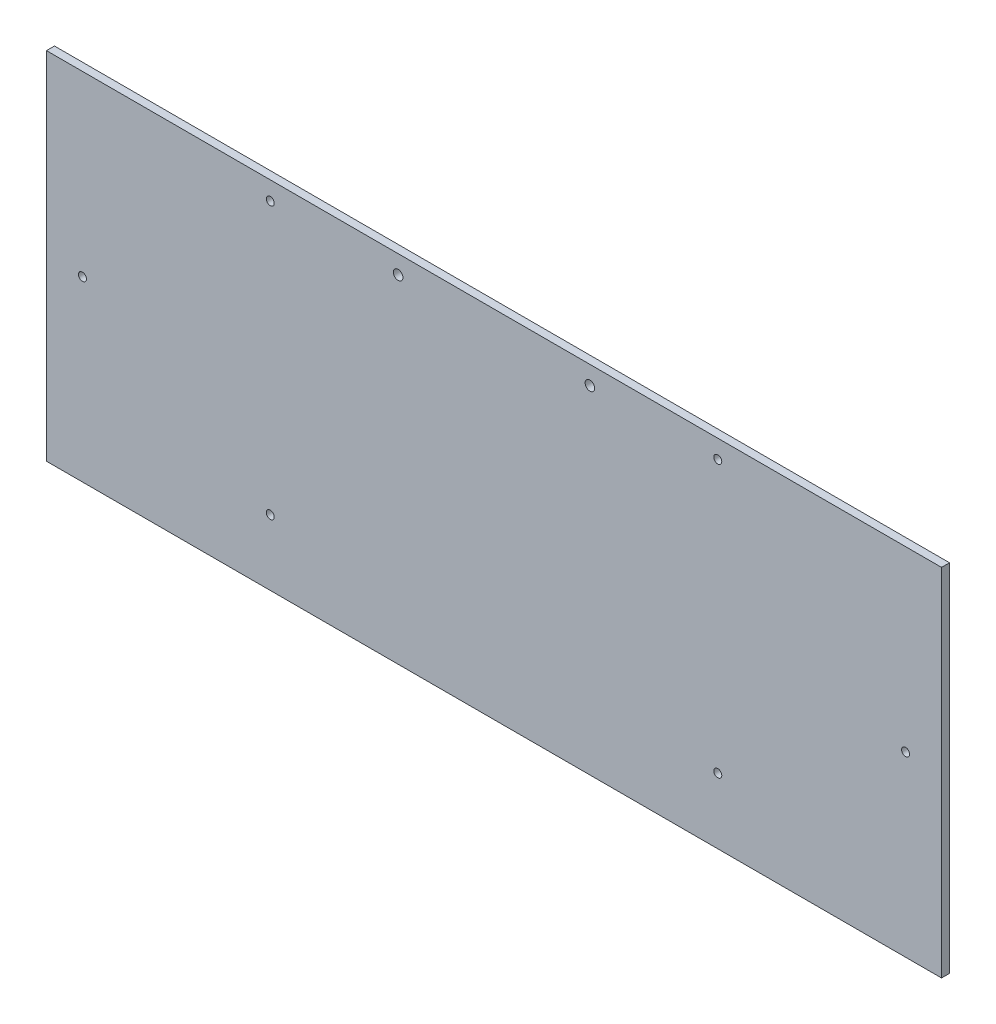
ISO-10303-21;
HEADER;
FILE_DESCRIPTION(('STEP AP214'),'2;1');
FILE_NAME('part.step','',(''),(''),'','','');
FILE_SCHEMA(('AUTOMOTIVE_DESIGN { 1 0 10303 214 1 1 1 1 }'));
ENDSEC;
DATA;
#1=APPLICATION_CONTEXT('core data for automotive mechanical design processes');
#2=APPLICATION_PROTOCOL_DEFINITION('international standard','automotive_design',2000,#1);
#3=PRODUCT_CONTEXT('',#1,'mechanical');
#4=PRODUCT('Part','Part','',(#3));
#5=PRODUCT_RELATED_PRODUCT_CATEGORY('part','',(#4));
#6=PRODUCT_DEFINITION_FORMATION('','',#4);
#7=PRODUCT_DEFINITION_CONTEXT('part definition',#1,'design');
#8=PRODUCT_DEFINITION('design','',#6,#7);
#9=PRODUCT_DEFINITION_SHAPE('','',#8);
#10=(LENGTH_UNIT() NAMED_UNIT(*) SI_UNIT(.MILLI.,.METRE.));
#11=(NAMED_UNIT(*) PLANE_ANGLE_UNIT() SI_UNIT($,.RADIAN.));
#12=(NAMED_UNIT(*) SI_UNIT($,.STERADIAN.) SOLID_ANGLE_UNIT());
#13=UNCERTAINTY_MEASURE_WITH_UNIT(LENGTH_MEASURE(1.E-05),#10,'distance_accuracy_value','');
#14=(GEOMETRIC_REPRESENTATION_CONTEXT(3) GLOBAL_UNCERTAINTY_ASSIGNED_CONTEXT((#13)) GLOBAL_UNIT_ASSIGNED_CONTEXT((#10,
#11,#12)) REPRESENTATION_CONTEXT('',''));
#15=CARTESIAN_POINT('',(0.,0.,0.));
#16=DIRECTION('',(0.,0.,1.));
#17=DIRECTION('',(1.,0.,0.));
#18=AXIS2_PLACEMENT_3D('',#15,#16,#17);
#19=CARTESIAN_POINT('',(-280.,222.5,5.));
#20=DIRECTION('',(1.,0.,0.));
#21=DIRECTION('',(0.,0.,-1.));
#22=AXIS2_PLACEMENT_3D('',#19,#20,#21);
#23=PLANE('',#22);
#24=DIRECTION('',(0.,-1.,0.));
#25=VECTOR('',#24,1.);
#26=CARTESIAN_POINT('',(-280.,222.5,0.));
#27=LINE('',#26,#25);
#28=CARTESIAN_POINT('',(-280.,222.5,0.));
#29=VERTEX_POINT('',#28);
#30=CARTESIAN_POINT('',(-280.,0.,0.));
#31=VERTEX_POINT('',#30);
#32=EDGE_CURVE('E200',#29,#31,#27,.T.);
#33=ORIENTED_EDGE('',*,*,#32,.T.);
#34=DIRECTION('',(0.,0.,-1.));
#35=VECTOR('',#34,1.);
#36=CARTESIAN_POINT('',(-280.,0.,5.));
#37=LINE('',#36,#35);
#38=CARTESIAN_POINT('',(-280.,0.,5.));
#39=VERTEX_POINT('',#38);
#40=EDGE_CURVE('E12',#39,#31,#37,.T.);
#41=ORIENTED_EDGE('',*,*,#40,.F.);
#42=DIRECTION('',(0.,-1.,0.));
#43=VECTOR('',#42,1.);
#44=CARTESIAN_POINT('',(-280.,222.5,5.));
#45=LINE('',#44,#43);
#46=CARTESIAN_POINT('',(-280.,222.5,5.));
#47=VERTEX_POINT('',#46);
#48=EDGE_CURVE('E99',#47,#39,#45,.T.);
#49=ORIENTED_EDGE('',*,*,#48,.F.);
#50=DIRECTION('',(0.,0.,-1.));
#51=VECTOR('',#50,1.);
#52=CARTESIAN_POINT('',(-280.,222.5,5.));
#53=LINE('',#52,#51);
#54=EDGE_CURVE('E112',#47,#29,#53,.T.);
#55=ORIENTED_EDGE('',*,*,#54,.T.);
#56=EDGE_LOOP('',(#33,#41,#49,#55));
#57=FACE_BOUND('',#56,.T.);
#58=ADVANCED_FACE('F46',(#57),#23,.F.);
#59=CARTESIAN_POINT('',(-280.,0.,5.));
#60=DIRECTION('',(0.,1.,0.));
#61=DIRECTION('',(-1.,0.,0.));
#62=AXIS2_PLACEMENT_3D('',#59,#60,#61);
#63=PLANE('',#62);
#64=DIRECTION('',(1.,0.,0.));
#65=VECTOR('',#64,1.);
#66=CARTESIAN_POINT('',(-280.,0.,0.));
#67=LINE('',#66,#65);
#68=CARTESIAN_POINT('',(280.,1.02870331128378E-13,0.));
#69=VERTEX_POINT('',#68);
#70=EDGE_CURVE('E104',#31,#69,#67,.T.);
#71=ORIENTED_EDGE('',*,*,#70,.T.);
#72=DIRECTION('',(0.,0.,-1.));
#73=VECTOR('',#72,1.);
#74=CARTESIAN_POINT('',(280.,1.02870331128378E-13,5.));
#75=LINE('',#74,#73);
#76=CARTESIAN_POINT('',(280.,1.02870331128378E-13,5.));
#77=VERTEX_POINT('',#76);
#78=EDGE_CURVE('E55',#77,#69,#75,.T.);
#79=ORIENTED_EDGE('',*,*,#78,.F.);
#80=DIRECTION('',(1.,0.,0.));
#81=VECTOR('',#80,1.);
#82=CARTESIAN_POINT('',(-280.,0.,5.));
#83=LINE('',#82,#81);
#84=EDGE_CURVE('E94',#39,#77,#83,.T.);
#85=ORIENTED_EDGE('',*,*,#84,.F.);
#86=ORIENTED_EDGE('',*,*,#40,.T.);
#87=EDGE_LOOP('',(#71,#79,#85,#86));
#88=FACE_BOUND('',#87,.T.);
#89=ADVANCED_FACE('F103',(#88),#63,.F.);
#90=CARTESIAN_POINT('',(280.,222.5,5.));
#91=DIRECTION('',(-1.,0.,0.));
#92=DIRECTION('',(0.,-1.,0.));
#93=AXIS2_PLACEMENT_3D('',#90,#91,#92);
#94=PLANE('',#93);
#95=DIRECTION('',(0.,1.,0.));
#96=VECTOR('',#95,1.);
#97=CARTESIAN_POINT('',(280.,222.5,0.));
#98=LINE('',#97,#96);
#99=CARTESIAN_POINT('',(280.,222.5,0.));
#100=VERTEX_POINT('',#99);
#101=EDGE_CURVE('E81',#69,#100,#98,.T.);
#102=ORIENTED_EDGE('',*,*,#101,.T.);
#103=DIRECTION('',(0.,0.,-1.));
#104=VECTOR('',#103,1.);
#105=CARTESIAN_POINT('',(280.,222.5,5.));
#106=LINE('',#105,#104);
#107=CARTESIAN_POINT('',(280.,222.5,5.));
#108=VERTEX_POINT('',#107);
#109=EDGE_CURVE('E105',#108,#100,#106,.T.);
#110=ORIENTED_EDGE('',*,*,#109,.F.);
#111=DIRECTION('',(0.,1.,0.));
#112=VECTOR('',#111,1.);
#113=CARTESIAN_POINT('',(280.,222.5,5.));
#114=LINE('',#113,#112);
#115=EDGE_CURVE('E97',#77,#108,#114,.T.);
#116=ORIENTED_EDGE('',*,*,#115,.F.);
#117=ORIENTED_EDGE('',*,*,#78,.T.);
#118=EDGE_LOOP('',(#102,#110,#116,#117));
#119=FACE_BOUND('',#118,.T.);
#120=ADVANCED_FACE('F107',(#119),#94,.F.);
#121=CARTESIAN_POINT('',(-280.,222.5,5.));
#122=DIRECTION('',(0.,-1.,0.));
#123=DIRECTION('',(1.,0.,0.));
#124=AXIS2_PLACEMENT_3D('',#121,#122,#123);
#125=PLANE('',#124);
#126=DIRECTION('',(-1.,0.,0.));
#127=VECTOR('',#126,1.);
#128=CARTESIAN_POINT('',(-280.,222.5,0.));
#129=LINE('',#128,#127);
#130=EDGE_CURVE('E87',#100,#29,#129,.T.);
#131=ORIENTED_EDGE('',*,*,#130,.T.);
#132=ORIENTED_EDGE('',*,*,#54,.F.);
#133=DIRECTION('',(-1.,0.,0.));
#134=VECTOR('',#133,1.);
#135=CARTESIAN_POINT('',(-280.,222.5,5.));
#136=LINE('',#135,#134);
#137=EDGE_CURVE('E64',#108,#47,#136,.T.);
#138=ORIENTED_EDGE('',*,*,#137,.F.);
#139=ORIENTED_EDGE('',*,*,#109,.T.);
#140=EDGE_LOOP('',(#131,#132,#138,#139));
#141=FACE_BOUND('',#140,.T.);
#142=ADVANCED_FACE('F237',(#141),#125,.F.);
#143=CARTESIAN_POINT('',(0.,0.,5.));
#144=DIRECTION('',(0.,0.,1.));
#145=DIRECTION('',(1.,0.,0.));
#146=AXIS2_PLACEMENT_3D('',#143,#144,#145);
#147=PLANE('',#146);
#148=CARTESIAN_POINT('',(257.5,111.25,5.));
#149=DIRECTION('',(0.,0.,-1.));
#150=DIRECTION('',(-1.,0.,0.));
#151=AXIS2_PLACEMENT_3D('',#148,#149,#150);
#152=CIRCLE('',#151,2.50000000000002);
#153=CARTESIAN_POINT('',(255.,111.25,5.));
#154=VERTEX_POINT('',#153);
#155=EDGE_CURVE('E124',#154,#154,#152,.T.);
#156=ORIENTED_EDGE('',*,*,#155,.T.);
#157=EDGE_LOOP('',(#156));
#158=FACE_BOUND('',#157,.T.);
#159=CARTESIAN_POINT('',(-140.,40.9999999999998,5.));
#160=DIRECTION('',(0.,0.,-1.));
#161=DIRECTION('',(1.,0.,0.));
#162=AXIS2_PLACEMENT_3D('',#159,#160,#161);
#163=CIRCLE('',#162,2.5);
#164=CARTESIAN_POINT('',(-137.5,40.9999999999998,5.));
#165=VERTEX_POINT('',#164);
#166=EDGE_CURVE('E159',#165,#165,#163,.T.);
#167=ORIENTED_EDGE('',*,*,#166,.T.);
#168=EDGE_LOOP('',(#167));
#169=FACE_BOUND('',#168,.T.);
#170=CARTESIAN_POINT('',(-60.0000000000001,211.,5.));
#171=DIRECTION('',(0.,0.,-1.));
#172=DIRECTION('',(1.,0.,0.));
#173=AXIS2_PLACEMENT_3D('',#170,#171,#172);
#174=CIRCLE('',#173,3.);
#175=CARTESIAN_POINT('',(-57.0000000000001,211.,5.));
#176=VERTEX_POINT('',#175);
#177=EDGE_CURVE('E136',#176,#176,#174,.T.);
#178=ORIENTED_EDGE('',*,*,#177,.T.);
#179=EDGE_LOOP('',(#178));
#180=FACE_BOUND('',#179,.T.);
#181=CARTESIAN_POINT('',(-140.,211.,5.));
#182=DIRECTION('',(0.,0.,-1.));
#183=DIRECTION('',(1.,0.,0.));
#184=AXIS2_PLACEMENT_3D('',#181,#182,#183);
#185=CIRCLE('',#184,2.5);
#186=CARTESIAN_POINT('',(-137.5,211.,5.));
#187=VERTEX_POINT('',#186);
#188=EDGE_CURVE('E130',#187,#187,#185,.T.);
#189=ORIENTED_EDGE('',*,*,#188,.T.);
#190=EDGE_LOOP('',(#189));
#191=FACE_BOUND('',#190,.T.);
#192=CARTESIAN_POINT('',(-257.5,111.25,5.));
#193=DIRECTION('',(0.,0.,-1.));
#194=DIRECTION('',(1.,0.,0.));
#195=AXIS2_PLACEMENT_3D('',#192,#193,#194);
#196=CIRCLE('',#195,2.49999999999992);
#197=CARTESIAN_POINT('',(-255.,111.25,5.));
#198=VERTEX_POINT('',#197);
#199=EDGE_CURVE('E135',#198,#198,#196,.T.);
#200=ORIENTED_EDGE('',*,*,#199,.T.);
#201=EDGE_LOOP('',(#200));
#202=FACE_BOUND('',#201,.T.);
#203=CARTESIAN_POINT('',(140.,40.9999999999999,5.));
#204=DIRECTION('',(0.,0.,-1.));
#205=DIRECTION('',(-1.,0.,0.));
#206=AXIS2_PLACEMENT_3D('',#203,#204,#205);
#207=CIRCLE('',#206,2.5);
#208=CARTESIAN_POINT('',(137.5,40.9999999999999,5.));
#209=VERTEX_POINT('',#208);
#210=EDGE_CURVE('E147',#209,#209,#207,.T.);
#211=ORIENTED_EDGE('',*,*,#210,.T.);
#212=EDGE_LOOP('',(#211));
#213=FACE_BOUND('',#212,.T.);
#214=CARTESIAN_POINT('',(140.,211.,5.));
#215=DIRECTION('',(0.,0.,-1.));
#216=DIRECTION('',(-1.,0.,0.));
#217=AXIS2_PLACEMENT_3D('',#214,#215,#216);
#218=CIRCLE('',#217,2.5);
#219=CARTESIAN_POINT('',(137.5,211.,5.));
#220=VERTEX_POINT('',#219);
#221=EDGE_CURVE('E158',#220,#220,#218,.T.);
#222=ORIENTED_EDGE('',*,*,#221,.T.);
#223=EDGE_LOOP('',(#222));
#224=FACE_BOUND('',#223,.T.);
#225=CARTESIAN_POINT('',(60.,211.,5.));
#226=DIRECTION('',(0.,0.,-1.));
#227=DIRECTION('',(-1.,0.,0.));
#228=AXIS2_PLACEMENT_3D('',#225,#226,#227);
#229=CIRCLE('',#228,3.);
#230=CARTESIAN_POINT('',(57.,211.,5.));
#231=VERTEX_POINT('',#230);
#232=EDGE_CURVE('E129',#231,#231,#229,.T.);
#233=ORIENTED_EDGE('',*,*,#232,.T.);
#234=EDGE_LOOP('',(#233));
#235=FACE_BOUND('',#234,.T.);
#236=ORIENTED_EDGE('',*,*,#48,.T.);
#237=ORIENTED_EDGE('',*,*,#84,.T.);
#238=ORIENTED_EDGE('',*,*,#115,.T.);
#239=ORIENTED_EDGE('',*,*,#137,.T.);
#240=EDGE_LOOP('',(#236,#237,#238,#239));
#241=FACE_BOUND('',#240,.T.);
#242=ADVANCED_FACE('F95',(#158,#169,#180,#191,#202,#213,#224,#235,#241),#147,.T.);
#243=CARTESIAN_POINT('',(0.,0.,0.));
#244=DIRECTION('',(0.,0.,1.));
#245=DIRECTION('',(1.,0.,0.));
#246=AXIS2_PLACEMENT_3D('',#243,#244,#245);
#247=PLANE('',#246);
#248=CARTESIAN_POINT('',(257.5,111.25,0.));
#249=DIRECTION('',(0.,0.,1.));
#250=DIRECTION('',(1.,0.,0.));
#251=AXIS2_PLACEMENT_3D('',#248,#249,#250);
#252=CIRCLE('',#251,2.50000000000002);
#253=CARTESIAN_POINT('',(260.,111.25,0.));
#254=VERTEX_POINT('',#253);
#255=EDGE_CURVE('E49',#254,#254,#252,.T.);
#256=ORIENTED_EDGE('',*,*,#255,.T.);
#257=EDGE_LOOP('',(#256));
#258=FACE_BOUND('',#257,.T.);
#259=CARTESIAN_POINT('',(-140.,40.9999999999998,0.));
#260=DIRECTION('',(0.,0.,1.));
#261=DIRECTION('',(1.,0.,0.));
#262=AXIS2_PLACEMENT_3D('',#259,#260,#261);
#263=CIRCLE('',#262,2.5);
#264=CARTESIAN_POINT('',(-137.5,40.9999999999998,0.));
#265=VERTEX_POINT('',#264);
#266=EDGE_CURVE('E195',#265,#265,#263,.T.);
#267=ORIENTED_EDGE('',*,*,#266,.T.);
#268=EDGE_LOOP('',(#267));
#269=FACE_BOUND('',#268,.T.);
#270=CARTESIAN_POINT('',(-60.0000000000001,211.,0.));
#271=DIRECTION('',(0.,0.,1.));
#272=DIRECTION('',(1.,0.,0.));
#273=AXIS2_PLACEMENT_3D('',#270,#271,#272);
#274=CIRCLE('',#273,3.);
#275=CARTESIAN_POINT('',(-57.0000000000001,211.,0.));
#276=VERTEX_POINT('',#275);
#277=EDGE_CURVE('E193',#276,#276,#274,.T.);
#278=ORIENTED_EDGE('',*,*,#277,.T.);
#279=EDGE_LOOP('',(#278));
#280=FACE_BOUND('',#279,.T.);
#281=CARTESIAN_POINT('',(-140.,211.,0.));
#282=DIRECTION('',(0.,0.,1.));
#283=DIRECTION('',(1.,0.,0.));
#284=AXIS2_PLACEMENT_3D('',#281,#282,#283);
#285=CIRCLE('',#284,2.5);
#286=CARTESIAN_POINT('',(-137.5,211.,0.));
#287=VERTEX_POINT('',#286);
#288=EDGE_CURVE('E185',#287,#287,#285,.T.);
#289=ORIENTED_EDGE('',*,*,#288,.T.);
#290=EDGE_LOOP('',(#289));
#291=FACE_BOUND('',#290,.T.);
#292=CARTESIAN_POINT('',(-257.5,111.25,0.));
#293=DIRECTION('',(0.,0.,1.));
#294=DIRECTION('',(1.,0.,0.));
#295=AXIS2_PLACEMENT_3D('',#292,#293,#294);
#296=CIRCLE('',#295,2.49999999999992);
#297=CARTESIAN_POINT('',(-255.,111.25,0.));
#298=VERTEX_POINT('',#297);
#299=EDGE_CURVE('E181',#298,#298,#296,.T.);
#300=ORIENTED_EDGE('',*,*,#299,.T.);
#301=EDGE_LOOP('',(#300));
#302=FACE_BOUND('',#301,.T.);
#303=CARTESIAN_POINT('',(140.,40.9999999999999,0.));
#304=DIRECTION('',(0.,0.,1.));
#305=DIRECTION('',(1.,0.,0.));
#306=AXIS2_PLACEMENT_3D('',#303,#304,#305);
#307=CIRCLE('',#306,2.5);
#308=CARTESIAN_POINT('',(142.5,40.9999999999999,0.));
#309=VERTEX_POINT('',#308);
#310=EDGE_CURVE('E179',#309,#309,#307,.T.);
#311=ORIENTED_EDGE('',*,*,#310,.T.);
#312=EDGE_LOOP('',(#311));
#313=FACE_BOUND('',#312,.T.);
#314=CARTESIAN_POINT('',(140.,211.,0.));
#315=DIRECTION('',(0.,0.,1.));
#316=DIRECTION('',(1.,0.,0.));
#317=AXIS2_PLACEMENT_3D('',#314,#315,#316);
#318=CIRCLE('',#317,2.5);
#319=CARTESIAN_POINT('',(142.5,211.,0.));
#320=VERTEX_POINT('',#319);
#321=EDGE_CURVE('E182',#320,#320,#318,.T.);
#322=ORIENTED_EDGE('',*,*,#321,.T.);
#323=EDGE_LOOP('',(#322));
#324=FACE_BOUND('',#323,.T.);
#325=CARTESIAN_POINT('',(60.,211.,0.));
#326=DIRECTION('',(0.,0.,1.));
#327=DIRECTION('',(1.,0.,0.));
#328=AXIS2_PLACEMENT_3D('',#325,#326,#327);
#329=CIRCLE('',#328,3.);
#330=CARTESIAN_POINT('',(63.,211.,0.));
#331=VERTEX_POINT('',#330);
#332=EDGE_CURVE('E128',#331,#331,#329,.T.);
#333=ORIENTED_EDGE('',*,*,#332,.T.);
#334=EDGE_LOOP('',(#333));
#335=FACE_BOUND('',#334,.T.);
#336=ORIENTED_EDGE('',*,*,#32,.F.);
#337=ORIENTED_EDGE('',*,*,#130,.F.);
#338=ORIENTED_EDGE('',*,*,#101,.F.);
#339=ORIENTED_EDGE('',*,*,#70,.F.);
#340=EDGE_LOOP('',(#336,#337,#338,#339));
#341=FACE_BOUND('',#340,.T.);
#342=ADVANCED_FACE('F214',(#258,#269,#280,#291,#302,#313,#324,#335,#341),#247,.F.);
#343=CARTESIAN_POINT('',(60.,211.,5.));
#344=DIRECTION('',(0.,0.,-1.));
#345=DIRECTION('',(-1.,0.,0.));
#346=AXIS2_PLACEMENT_3D('',#343,#344,#345);
#347=CYLINDRICAL_SURFACE('',#346,3.);
#348=ORIENTED_EDGE('',*,*,#232,.F.);
#349=EDGE_LOOP('',(#348));
#350=FACE_BOUND('',#349,.T.);
#351=ORIENTED_EDGE('',*,*,#332,.F.);
#352=EDGE_LOOP('',(#351));
#353=FACE_BOUND('',#352,.T.);
#354=ADVANCED_FACE('F217',(#350,#353),#347,.F.);
#355=CARTESIAN_POINT('',(140.,211.,5.));
#356=DIRECTION('',(0.,0.,-1.));
#357=DIRECTION('',(-1.,0.,0.));
#358=AXIS2_PLACEMENT_3D('',#355,#356,#357);
#359=CYLINDRICAL_SURFACE('',#358,2.5);
#360=ORIENTED_EDGE('',*,*,#221,.F.);
#361=EDGE_LOOP('',(#360));
#362=FACE_BOUND('',#361,.T.);
#363=ORIENTED_EDGE('',*,*,#321,.F.);
#364=EDGE_LOOP('',(#363));
#365=FACE_BOUND('',#364,.T.);
#366=ADVANCED_FACE('F175',(#362,#365),#359,.F.);
#367=CARTESIAN_POINT('',(140.,40.9999999999999,5.));
#368=DIRECTION('',(0.,0.,-1.));
#369=DIRECTION('',(-1.,0.,0.));
#370=AXIS2_PLACEMENT_3D('',#367,#368,#369);
#371=CYLINDRICAL_SURFACE('',#370,2.5);
#372=ORIENTED_EDGE('',*,*,#210,.F.);
#373=EDGE_LOOP('',(#372));
#374=FACE_BOUND('',#373,.T.);
#375=ORIENTED_EDGE('',*,*,#310,.F.);
#376=EDGE_LOOP('',(#375));
#377=FACE_BOUND('',#376,.T.);
#378=ADVANCED_FACE('F171',(#374,#377),#371,.F.);
#379=CARTESIAN_POINT('',(-257.5,111.25,5.));
#380=DIRECTION('',(0.,0.,-1.));
#381=DIRECTION('',(-1.,0.,0.));
#382=AXIS2_PLACEMENT_3D('',#379,#380,#381);
#383=CYLINDRICAL_SURFACE('',#382,2.49999999999992);
#384=ORIENTED_EDGE('',*,*,#199,.F.);
#385=EDGE_LOOP('',(#384));
#386=FACE_BOUND('',#385,.T.);
#387=ORIENTED_EDGE('',*,*,#299,.F.);
#388=EDGE_LOOP('',(#387));
#389=FACE_BOUND('',#388,.T.);
#390=ADVANCED_FACE('F174',(#386,#389),#383,.F.);
#391=CARTESIAN_POINT('',(-140.,211.,5.));
#392=DIRECTION('',(0.,0.,-1.));
#393=DIRECTION('',(-1.,0.,0.));
#394=AXIS2_PLACEMENT_3D('',#391,#392,#393);
#395=CYLINDRICAL_SURFACE('',#394,2.5);
#396=ORIENTED_EDGE('',*,*,#188,.F.);
#397=EDGE_LOOP('',(#396));
#398=FACE_BOUND('',#397,.T.);
#399=ORIENTED_EDGE('',*,*,#288,.F.);
#400=EDGE_LOOP('',(#399));
#401=FACE_BOUND('',#400,.T.);
#402=ADVANCED_FACE('F246',(#398,#401),#395,.F.);
#403=CARTESIAN_POINT('',(-60.0000000000001,211.,5.));
#404=DIRECTION('',(0.,0.,-1.));
#405=DIRECTION('',(-1.,0.,0.));
#406=AXIS2_PLACEMENT_3D('',#403,#404,#405);
#407=CYLINDRICAL_SURFACE('',#406,3.);
#408=ORIENTED_EDGE('',*,*,#177,.F.);
#409=EDGE_LOOP('',(#408));
#410=FACE_BOUND('',#409,.T.);
#411=ORIENTED_EDGE('',*,*,#277,.F.);
#412=EDGE_LOOP('',(#411));
#413=FACE_BOUND('',#412,.T.);
#414=ADVANCED_FACE('F251',(#410,#413),#407,.F.);
#415=CARTESIAN_POINT('',(-140.,40.9999999999998,5.));
#416=DIRECTION('',(0.,0.,-1.));
#417=DIRECTION('',(-1.,0.,0.));
#418=AXIS2_PLACEMENT_3D('',#415,#416,#417);
#419=CYLINDRICAL_SURFACE('',#418,2.5);
#420=ORIENTED_EDGE('',*,*,#166,.F.);
#421=EDGE_LOOP('',(#420));
#422=FACE_BOUND('',#421,.T.);
#423=ORIENTED_EDGE('',*,*,#266,.F.);
#424=EDGE_LOOP('',(#423));
#425=FACE_BOUND('',#424,.T.);
#426=ADVANCED_FACE('F265',(#422,#425),#419,.F.);
#427=CARTESIAN_POINT('',(257.5,111.25,5.));
#428=DIRECTION('',(0.,0.,-1.));
#429=DIRECTION('',(-1.,0.,0.));
#430=AXIS2_PLACEMENT_3D('',#427,#428,#429);
#431=CYLINDRICAL_SURFACE('',#430,2.50000000000002);
#432=ORIENTED_EDGE('',*,*,#155,.F.);
#433=EDGE_LOOP('',(#432));
#434=FACE_BOUND('',#433,.T.);
#435=ORIENTED_EDGE('',*,*,#255,.F.);
#436=EDGE_LOOP('',(#435));
#437=FACE_BOUND('',#436,.T.);
#438=ADVANCED_FACE('F271',(#434,#437),#431,.F.);
#439=CLOSED_SHELL('',(#58,#89,#120,#142,#242,#342,#354,#366,#378,#390,#402,#414,#426,#438));
#440=MANIFOLD_SOLID_BREP('B2',#439);
#441=ADVANCED_BREP_SHAPE_REPRESENTATION('',(#18,#440),#14);
#442=SHAPE_DEFINITION_REPRESENTATION(#9,#441);
ENDSEC;
END-ISO-10303-21;
